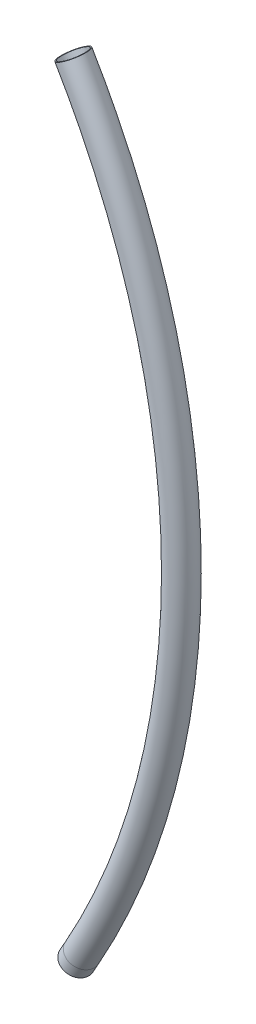
ISO-10303-21;
HEADER;
FILE_DESCRIPTION(('STEP AP214'),'2;1');
FILE_NAME('part.step','',(''),(''),'','','');
FILE_SCHEMA(('AUTOMOTIVE_DESIGN { 1 0 10303 214 1 1 1 1 }'));
ENDSEC;
DATA;
#1=APPLICATION_CONTEXT('core data for automotive mechanical design processes');
#2=APPLICATION_PROTOCOL_DEFINITION('international standard','automotive_design',2000,#1);
#3=PRODUCT_CONTEXT('',#1,'mechanical');
#4=PRODUCT('Part','Part','',(#3));
#5=PRODUCT_RELATED_PRODUCT_CATEGORY('part','',(#4));
#6=PRODUCT_DEFINITION_FORMATION('','',#4);
#7=PRODUCT_DEFINITION_CONTEXT('part definition',#1,'design');
#8=PRODUCT_DEFINITION('design','',#6,#7);
#9=PRODUCT_DEFINITION_SHAPE('','',#8);
#10=(LENGTH_UNIT() NAMED_UNIT(*) SI_UNIT(.MILLI.,.METRE.));
#11=(NAMED_UNIT(*) PLANE_ANGLE_UNIT() SI_UNIT($,.RADIAN.));
#12=(NAMED_UNIT(*) SI_UNIT($,.STERADIAN.) SOLID_ANGLE_UNIT());
#13=UNCERTAINTY_MEASURE_WITH_UNIT(LENGTH_MEASURE(1.E-05),#10,'distance_accuracy_value','');
#14=(GEOMETRIC_REPRESENTATION_CONTEXT(3) GLOBAL_UNCERTAINTY_ASSIGNED_CONTEXT((#13)) GLOBAL_UNIT_ASSIGNED_CONTEXT((#10,
#11,#12)) REPRESENTATION_CONTEXT('',''));
#15=CARTESIAN_POINT('',(0.,0.,0.));
#16=DIRECTION('',(0.,0.,1.));
#17=DIRECTION('',(1.,0.,0.));
#18=AXIS2_PLACEMENT_3D('',#15,#16,#17);
#19=CARTESIAN_POINT('',(-931.887676843266,-7135.04746069417,0.));
#20=DIRECTION('',(0.490230989347439,0.871592552218885,0.));
#21=DIRECTION('',(0.,0.,1.));
#22=AXIS2_PLACEMENT_3D('',#19,#20,#21);
#23=CYLINDRICAL_SURFACE('',#22,115.);
#24=CARTESIAN_POINT('',(-882.864577908522,-7047.88820547228,0.));
#25=DIRECTION('',(-0.490230989347439,-0.871592552218886,0.));
#26=DIRECTION('',(0.,0.,1.));
#27=AXIS2_PLACEMENT_3D('',#24,#25,#26);
#28=CIRCLE('',#27,115.);
#29=CARTESIAN_POINT('',(-882.864577908522,-7047.88820547228,115.));
#30=VERTEX_POINT('',#29);
#31=EDGE_CURVE('E96',#30,#30,#28,.T.);
#32=CARTESIAN_POINT('',(-926.985366949792,-7126.33153517198,0.));
#33=DIRECTION('',(0.490230989347439,0.871592552218886,0.));
#34=DIRECTION('',(0.,0.,1.));
#35=AXIS2_PLACEMENT_3D('',#32,#33,#34);
#36=CIRCLE('',#35,115.);
#37=CARTESIAN_POINT('',(-926.985366949792,-7126.33153517198,115.));
#38=VERTEX_POINT('',#37);
#39=EDGE_CURVE('E113',#38,#38,#36,.T.);
#40=CARTESIAN_POINT('',(-882.864577908522,-7047.88820547228,115.));
#41=CARTESIAN_POINT('',(-883.324169461036,-7048.70532348999,115.));
#42=CARTESIAN_POINT('',(-883.783761013549,-7049.52244150769,115.));
#43=CARTESIAN_POINT('',(-884.702944118575,-7051.1566775431,115.));
#44=CARTESIAN_POINT('',(-885.162535671088,-7051.97379556081,115.));
#45=CARTESIAN_POINT('',(-886.081718776115,-7053.60803159622,115.));
#46=CARTESIAN_POINT('',(-886.541310328628,-7054.42514961392,115.));
#47=CARTESIAN_POINT('',(-887.460493433655,-7056.05938564933,115.));
#48=CARTESIAN_POINT('',(-887.920084986168,-7056.87650366704,115.));
#49=CARTESIAN_POINT('',(-888.839268091194,-7058.51073970245,115.));
#50=CARTESIAN_POINT('',(-889.298859643707,-7059.32785772015,115.));
#51=CARTESIAN_POINT('',(-890.218042748734,-7060.96209375556,115.));
#52=CARTESIAN_POINT('',(-890.677634301247,-7061.77921177327,115.));
#53=CARTESIAN_POINT('',(-891.596817406274,-7063.41344780868,115.));
#54=CARTESIAN_POINT('',(-892.056408958787,-7064.23056582638,115.));
#55=CARTESIAN_POINT('',(-892.975592063813,-7065.8648018618,115.));
#56=CARTESIAN_POINT('',(-893.435183616327,-7066.6819198795,115.));
#57=CARTESIAN_POINT('',(-894.354366721353,-7068.31615591491,115.));
#58=CARTESIAN_POINT('',(-894.813958273866,-7069.13327393262,115.));
#59=CARTESIAN_POINT('',(-895.733141378893,-7070.76750996803,115.));
#60=CARTESIAN_POINT('',(-896.192732931406,-7071.58462798573,115.));
#61=CARTESIAN_POINT('',(-897.111916036432,-7073.21886402114,115.));
#62=CARTESIAN_POINT('',(-897.571507588945,-7074.03598203885,115.));
#63=CARTESIAN_POINT('',(-898.490690693972,-7075.67021807426,115.));
#64=CARTESIAN_POINT('',(-898.950282246485,-7076.48733609196,115.));
#65=CARTESIAN_POINT('',(-899.869465351512,-7078.12157212737,115.));
#66=CARTESIAN_POINT('',(-900.329056904025,-7078.93869014508,115.));
#67=CARTESIAN_POINT('',(-901.248240009051,-7080.57292618049,115.));
#68=CARTESIAN_POINT('',(-901.707831561565,-7081.39004419819,115.));
#69=CARTESIAN_POINT('',(-902.627014666591,-7083.02428023361,115.));
#70=CARTESIAN_POINT('',(-903.086606219104,-7083.84139825131,115.));
#71=CARTESIAN_POINT('',(-904.005789324131,-7085.47563428672,115.));
#72=CARTESIAN_POINT('',(-904.465380876644,-7086.29275230443,115.));
#73=CARTESIAN_POINT('',(-905.384563981671,-7087.92698833984,115.));
#74=CARTESIAN_POINT('',(-905.844155534184,-7088.74410635754,115.));
#75=CARTESIAN_POINT('',(-906.76333863921,-7090.37834239295,115.));
#76=CARTESIAN_POINT('',(-907.222930191723,-7091.19546041066,115.));
#77=CARTESIAN_POINT('',(-908.14211329675,-7092.82969644607,115.));
#78=CARTESIAN_POINT('',(-908.601704849263,-7093.64681446377,115.));
#79=CARTESIAN_POINT('',(-909.520887954289,-7095.28105049918,115.));
#80=CARTESIAN_POINT('',(-909.980479506803,-7096.09816851689,115.));
#81=CARTESIAN_POINT('',(-910.899662611829,-7097.7324045523,115.));
#82=CARTESIAN_POINT('',(-911.359254164342,-7098.54952257,115.));
#83=CARTESIAN_POINT('',(-912.278437269369,-7100.18375860541,115.));
#84=CARTESIAN_POINT('',(-912.738028821882,-7101.00087662312,115.));
#85=CARTESIAN_POINT('',(-913.657211926909,-7102.63511265853,115.));
#86=CARTESIAN_POINT('',(-914.116803479422,-7103.45223067624,115.));
#87=CARTESIAN_POINT('',(-915.035986584448,-7105.08646671165,115.));
#88=CARTESIAN_POINT('',(-915.495578136962,-7105.90358472935,115.));
#89=CARTESIAN_POINT('',(-916.414761241988,-7107.53782076476,115.));
#90=CARTESIAN_POINT('',(-916.874352794501,-7108.35493878247,115.));
#91=CARTESIAN_POINT('',(-917.793535899528,-7109.98917481788,115.));
#92=CARTESIAN_POINT('',(-918.253127452041,-7110.80629283558,115.));
#93=CARTESIAN_POINT('',(-919.172310557067,-7112.44052887099,115.));
#94=CARTESIAN_POINT('',(-919.63190210958,-7113.2576468887,115.));
#95=CARTESIAN_POINT('',(-920.551085214607,-7114.89188292411,115.));
#96=CARTESIAN_POINT('',(-921.01067676712,-7115.70900094181,115.));
#97=CARTESIAN_POINT('',(-921.929859872147,-7117.34323697722,115.));
#98=CARTESIAN_POINT('',(-922.38945142466,-7118.16035499493,115.));
#99=CARTESIAN_POINT('',(-923.308634529686,-7119.79459103034,115.));
#100=CARTESIAN_POINT('',(-923.7682260822,-7120.61170904804,115.));
#101=CARTESIAN_POINT('',(-924.687409187226,-7122.24594508346,115.));
#102=CARTESIAN_POINT('',(-925.147000739739,-7123.06306310116,115.));
#103=CARTESIAN_POINT('',(-926.066183844766,-7124.69729913657,115.));
#104=CARTESIAN_POINT('',(-926.525775397279,-7125.51441715428,115.));
#105=CARTESIAN_POINT('',(-926.985366949792,-7126.33153517198,115.));
#106=B_SPLINE_CURVE_WITH_KNOTS('',3,(#40,#41,#42,#43,#44,#45,#46,#47,#48,#49,#50,#51,#52,#53,
#54,#55,#56,#57,#58,#59,#60,#61,#62,#63,#64,#65,#66,#67,#68,#69,#70,#71,#72,#73,#74,#75,#76,#77,
#78,#79,#80,#81,#82,#83,#84,#85,#86,#87,#88,#89,#90,#91,#92,#93,#94,#95,#96,#97,#98,#99,#100,
#101,#102,#103,#104,#105),.UNSPECIFIED.,.F.,.F.,(4,2,2,2,2,2,2,2,2,2,2,2,2,2,2,2,2,2,2,2,2,2,2,
2,2,2,2,2,2,2,2,2,4),(0.,2.81249999999987,5.62499999999974,8.43749999999966,11.2499999999995,
14.0624999999994,16.875,19.6874999999999,22.4999999999998,25.3124999999997,28.1249999999996,
30.9375000000002,33.7500000000002,36.5625,39.3749999999999,42.1874999999998,44.9999999999997,
47.8125000000003,50.6250000000002,53.4375000000001,56.25,59.0624999999999,61.8750000000005,
64.6875000000004,67.5000000000003,70.3125000000002,73.1250000000001,75.9375000000007,
78.7500000000006,81.5625000000005,84.3750000000004,87.1875000000002,90.0000000000001),.UNSPECIFIED.);
#107=EDGE_CURVE('BSEAM88',#30,#38,#106,.T.);
#108=ORIENTED_EDGE('',*,*,#31,.F.);
#109=ORIENTED_EDGE('',*,*,#39,.F.);
#110=ORIENTED_EDGE('',*,*,#107,.T.);
#111=ORIENTED_EDGE('',*,*,#107,.F.);
#112=EDGE_LOOP('',(#108,#110,#109,#111));
#113=FACE_BOUND('',#112,.T.);
#114=ADVANCED_FACE('F88',(#113),#23,.F.);
#115=CARTESIAN_POINT('',(-6875.49354156986,-3677.30820433656,0.));
#116=DIRECTION('',(0.,0.,1.));
#117=DIRECTION('',(1.,0.,0.));
#118=AXIS2_PLACEMENT_3D('',#115,#116,#117);
#119=TOROIDAL_SURFACE('',#118,6875.49354156986,125.);
#120=CARTESIAN_POINT('',(-960.171153267882,-172.829286919269,0.));
#121=DIRECTION('',(-0.509705797297152,0.860348766606703,0.));
#122=DIRECTION('',(0.,0.,1.));
#123=AXIS2_PLACEMENT_3D('',#120,#121,#122);
#124=CIRCLE('',#123,125.);
#125=CARTESIAN_POINT('',(-960.171153267882,-172.829286919269,125.));
#126=VERTEX_POINT('',#125);
#127=EDGE_CURVE('E109',#126,#126,#124,.T.);
#128=ORIENTED_EDGE('',*,*,#127,.F.);
#129=EDGE_LOOP('',(#128));
#130=FACE_BOUND('',#129,.T.);
#131=CARTESIAN_POINT('',(-882.864577908522,-7047.88820547228,0.));
#132=DIRECTION('',(-0.490230989347439,-0.871592552218886,0.));
#133=DIRECTION('',(0.,0.,1.));
#134=AXIS2_PLACEMENT_3D('',#131,#132,#133);
#135=CIRCLE('',#134,125.);
#136=CARTESIAN_POINT('',(-882.864577908522,-7047.88820547228,125.));
#137=VERTEX_POINT('',#136);
#138=EDGE_CURVE('E112',#137,#137,#135,.T.);
#139=ORIENTED_EDGE('',*,*,#138,.F.);
#140=EDGE_LOOP('',(#139));
#141=FACE_BOUND('',#140,.T.);
#142=ADVANCED_FACE('F129',(#130,#141),#119,.T.);
#143=CARTESIAN_POINT('',(-931.887676843266,-7135.04746069417,0.));
#144=DIRECTION('',(0.490230989347439,0.871592552218885,0.));
#145=DIRECTION('',(0.,0.,1.));
#146=AXIS2_PLACEMENT_3D('',#143,#144,#145);
#147=CYLINDRICAL_SURFACE('',#146,125.);
#148=CARTESIAN_POINT('',(-931.887676843266,-7135.04746069417,0.));
#149=DIRECTION('',(0.490230989347439,0.871592552218886,0.));
#150=DIRECTION('',(0.,0.,1.));
#151=AXIS2_PLACEMENT_3D('',#148,#149,#150);
#152=CIRCLE('',#151,125.);
#153=CARTESIAN_POINT('',(-931.887676843266,-7135.04746069417,125.));
#154=VERTEX_POINT('',#153);
#155=EDGE_CURVE('E12',#154,#154,#152,.T.);
#156=CARTESIAN_POINT('',(-882.864577908522,-7047.88820547228,125.));
#157=CARTESIAN_POINT('',(-883.375235189092,-7048.79611438084,125.));
#158=CARTESIAN_POINT('',(-883.885892469663,-7049.7040232894,125.));
#159=CARTESIAN_POINT('',(-884.907207030803,-7051.51984110653,125.));
#160=CARTESIAN_POINT('',(-885.417864311373,-7052.42775001509,125.));
#161=CARTESIAN_POINT('',(-886.439178872514,-7054.24356783221,125.));
#162=CARTESIAN_POINT('',(-886.949836153084,-7055.15147674077,125.));
#163=CARTESIAN_POINT('',(-887.971150714225,-7056.9672945579,125.));
#164=CARTESIAN_POINT('',(-888.481807994795,-7057.87520346646,125.));
#165=CARTESIAN_POINT('',(-889.503122555936,-7059.69102128358,125.));
#166=CARTESIAN_POINT('',(-890.013779836506,-7060.59893019214,125.));
#167=CARTESIAN_POINT('',(-891.035094397646,-7062.41474800926,125.));
#168=CARTESIAN_POINT('',(-891.545751678216,-7063.32265691782,125.));
#169=CARTESIAN_POINT('',(-892.567066239357,-7065.13847473495,125.));
#170=CARTESIAN_POINT('',(-893.077723519927,-7066.04638364351,125.));
#171=CARTESIAN_POINT('',(-894.099038081068,-7067.86220146063,125.));
#172=CARTESIAN_POINT('',(-894.609695361638,-7068.77011036919,125.));
#173=CARTESIAN_POINT('',(-895.631009922778,-7070.58592818631,125.));
#174=CARTESIAN_POINT('',(-896.141667203349,-7071.49383709488,125.));
#175=CARTESIAN_POINT('',(-897.162981764489,-7073.309654912,125.));
#176=CARTESIAN_POINT('',(-897.67363904506,-7074.21756382056,125.));
#177=CARTESIAN_POINT('',(-898.6949536062,-7076.03338163768,125.));
#178=CARTESIAN_POINT('',(-899.20561088677,-7076.94129054624,125.));
#179=CARTESIAN_POINT('',(-900.226925447911,-7078.75710836337,125.));
#180=CARTESIAN_POINT('',(-900.737582728481,-7079.66501727193,125.));
#181=CARTESIAN_POINT('',(-901.758897289621,-7081.48083508905,125.));
#182=CARTESIAN_POINT('',(-902.269554570192,-7082.38874399761,125.));
#183=CARTESIAN_POINT('',(-903.290869131332,-7084.20456181473,125.));
#184=CARTESIAN_POINT('',(-903.801526411902,-7085.1124707233,125.));
#185=CARTESIAN_POINT('',(-904.822840973043,-7086.92828854042,125.));
#186=CARTESIAN_POINT('',(-905.333498253613,-7087.83619744898,125.));
#187=CARTESIAN_POINT('',(-906.354812814754,-7089.6520152661,125.));
#188=CARTESIAN_POINT('',(-906.865470095324,-7090.55992417466,125.));
#189=CARTESIAN_POINT('',(-907.886784656464,-7092.37574199179,125.));
#190=CARTESIAN_POINT('',(-908.397441937035,-7093.28365090035,125.));
#191=CARTESIAN_POINT('',(-909.418756498175,-7095.09946871747,125.));
#192=CARTESIAN_POINT('',(-909.929413778745,-7096.00737762603,125.));
#193=CARTESIAN_POINT('',(-910.950728339886,-7097.82319544315,125.));
#194=CARTESIAN_POINT('',(-911.461385620456,-7098.73110435172,125.));
#195=CARTESIAN_POINT('',(-912.482700181597,-7100.54692216884,125.));
#196=CARTESIAN_POINT('',(-912.993357462167,-7101.4548310774,125.));
#197=CARTESIAN_POINT('',(-914.014672023307,-7103.27064889452,125.));
#198=CARTESIAN_POINT('',(-914.525329303878,-7104.17855780308,125.));
#199=CARTESIAN_POINT('',(-915.546643865018,-7105.99437562021,125.));
#200=CARTESIAN_POINT('',(-916.057301145588,-7106.90228452877,125.));
#201=CARTESIAN_POINT('',(-917.078615706729,-7108.71810234589,125.));
#202=CARTESIAN_POINT('',(-917.589272987299,-7109.62601125445,125.));
#203=CARTESIAN_POINT('',(-918.61058754844,-7111.44182907157,125.));
#204=CARTESIAN_POINT('',(-919.12124482901,-7112.34973798014,125.));
#205=CARTESIAN_POINT('',(-920.14255939015,-7114.16555579726,125.));
#206=CARTESIAN_POINT('',(-920.653216670721,-7115.07346470582,125.));
#207=CARTESIAN_POINT('',(-921.674531231861,-7116.88928252294,125.));
#208=CARTESIAN_POINT('',(-922.185188512431,-7117.7971914315,125.));
#209=CARTESIAN_POINT('',(-923.206503073572,-7119.61300924863,125.));
#210=CARTESIAN_POINT('',(-923.717160354142,-7120.52091815719,125.));
#211=CARTESIAN_POINT('',(-924.738474915283,-7122.33673597431,125.));
#212=CARTESIAN_POINT('',(-925.249132195853,-7123.24464488287,125.));
#213=CARTESIAN_POINT('',(-926.270446756993,-7125.06046269999,125.));
#214=CARTESIAN_POINT('',(-926.781104037564,-7125.96837160856,125.));
#215=CARTESIAN_POINT('',(-927.802418598704,-7127.78418942568,125.));
#216=CARTESIAN_POINT('',(-928.313075879274,-7128.69209833424,125.));
#217=CARTESIAN_POINT('',(-929.334390440415,-7130.50791615136,125.));
#218=CARTESIAN_POINT('',(-929.845047720985,-7131.41582505992,125.));
#219=CARTESIAN_POINT('',(-930.866362282125,-7133.23164287705,125.));
#220=CARTESIAN_POINT('',(-931.377019562696,-7134.13955178561,125.));
#221=CARTESIAN_POINT('',(-931.887676843266,-7135.04746069417,125.));
#222=B_SPLINE_CURVE_WITH_KNOTS('',3,(#156,#157,#158,#159,#160,#161,#162,#163,#164,#165,#166,
#167,#168,#169,#170,#171,#172,#173,#174,#175,#176,#177,#178,#179,#180,#181,#182,#183,#184,#185,
#186,#187,#188,#189,#190,#191,#192,#193,#194,#195,#196,#197,#198,#199,#200,#201,#202,#203,#204,
#205,#206,#207,#208,#209,#210,#211,#212,#213,#214,#215,#216,#217,#218,#219,#220,#221),
.UNSPECIFIED.,.F.,.F.,(4,2,2,2,2,2,2,2,2,2,2,2,2,2,2,2,2,2,2,2,2,2,2,2,2,2,2,2,2,2,2,2,4),(0.,
3.12499999999968,6.24999999999935,9.37499999999986,12.4999999999995,15.6249999999992,
18.7499999999997,21.8749999999993,24.9999999999998,28.1249999999995,31.2499999999992,
34.3749999999997,37.4999999999993,40.6249999999998,43.7499999999995,46.8749999999992,
49.9999999999996,53.1249999999993,56.2499999999998,59.3749999999995,62.4999999999992,
65.6249999999996,68.7499999999993,71.8749999999998,74.9999999999995,78.1249999999992,
81.2499999999996,84.3749999999993,87.4999999999998,90.6249999999995,93.7499999999992,
96.8749999999996,99.9999999999993),.UNSPECIFIED.);
#223=EDGE_CURVE('BSEAM127',#137,#154,#222,.T.);
#224=ORIENTED_EDGE('',*,*,#138,.T.);
#225=ORIENTED_EDGE('',*,*,#155,.T.);
#226=ORIENTED_EDGE('',*,*,#223,.T.);
#227=ORIENTED_EDGE('',*,*,#223,.F.);
#228=EDGE_LOOP('',(#224,#226,#225,#227));
#229=FACE_BOUND('',#228,.T.);
#230=ADVANCED_FACE('F127',(#229),#147,.T.);
#231=CARTESIAN_POINT('',(-6875.49354156986,-3677.30820433656,0.));
#232=DIRECTION('',(0.,0.,1.));
#233=DIRECTION('',(1.,0.,0.));
#234=AXIS2_PLACEMENT_3D('',#231,#232,#233);
#235=TOROIDAL_SURFACE('',#234,6875.49354156986,115.);
#236=CARTESIAN_POINT('',(-960.171153267882,-172.829286919269,0.));
#237=DIRECTION('',(-0.509705797297152,0.860348766606703,0.));
#238=DIRECTION('',(0.,0.,1.));
#239=AXIS2_PLACEMENT_3D('',#236,#237,#238);
#240=CIRCLE('',#239,115.);
#241=CARTESIAN_POINT('',(-960.171153267882,-172.829286919269,115.));
#242=VERTEX_POINT('',#241);
#243=EDGE_CURVE('E101',#242,#242,#240,.T.);
#244=ORIENTED_EDGE('',*,*,#243,.T.);
#245=EDGE_LOOP('',(#244));
#246=FACE_BOUND('',#245,.T.);
#247=ORIENTED_EDGE('',*,*,#31,.T.);
#248=EDGE_LOOP('',(#247));
#249=FACE_BOUND('',#248,.T.);
#250=ADVANCED_FACE('F137',(#246,#249),#235,.F.);
#251=CARTESIAN_POINT('',(-931.887676843266,-7135.04746069417,0.));
#252=DIRECTION('',(0.490230989347439,0.871592552218886,0.));
#253=DIRECTION('',(0.,0.,1.));
#254=AXIS2_PLACEMENT_3D('',#251,#252,#253);
#255=PLANE('',#254);
#256=ORIENTED_EDGE('',*,*,#155,.F.);
#257=EDGE_LOOP('',(#256));
#258=FACE_BOUND('',#257,.T.);
#259=ADVANCED_FACE('F145',(#258),#255,.F.);
#260=CARTESIAN_POINT('',(-960.171153267882,-172.829286919269,0.));
#261=DIRECTION('',(-0.509705797297152,0.860348766606703,0.));
#262=DIRECTION('',(0.,0.,1.));
#263=AXIS2_PLACEMENT_3D('',#260,#261,#262);
#264=PLANE('',#263);
#265=ORIENTED_EDGE('',*,*,#243,.F.);
#266=EDGE_LOOP('',(#265));
#267=FACE_BOUND('',#266,.T.);
#268=ORIENTED_EDGE('',*,*,#127,.T.);
#269=EDGE_LOOP('',(#268));
#270=FACE_BOUND('',#269,.T.);
#271=ADVANCED_FACE('F147',(#267,#270),#264,.T.);
#272=CARTESIAN_POINT('',(-926.985366949792,-7126.33153517198,0.));
#273=DIRECTION('',(0.490230989347439,0.871592552218886,0.));
#274=DIRECTION('',(0.,0.,1.));
#275=AXIS2_PLACEMENT_3D('',#272,#273,#274);
#276=PLANE('',#275);
#277=ORIENTED_EDGE('',*,*,#39,.T.);
#278=EDGE_LOOP('',(#277));
#279=FACE_BOUND('',#278,.T.);
#280=ADVANCED_FACE('F90',(#279),#276,.T.);
#281=CLOSED_SHELL('',(#114,#142,#230,#250,#259,#271,#280));
#282=MANIFOLD_SOLID_BREP('B2',#281);
#283=ADVANCED_BREP_SHAPE_REPRESENTATION('',(#18,#282),#14);
#284=SHAPE_DEFINITION_REPRESENTATION(#9,#283);
ENDSEC;
END-ISO-10303-21;
